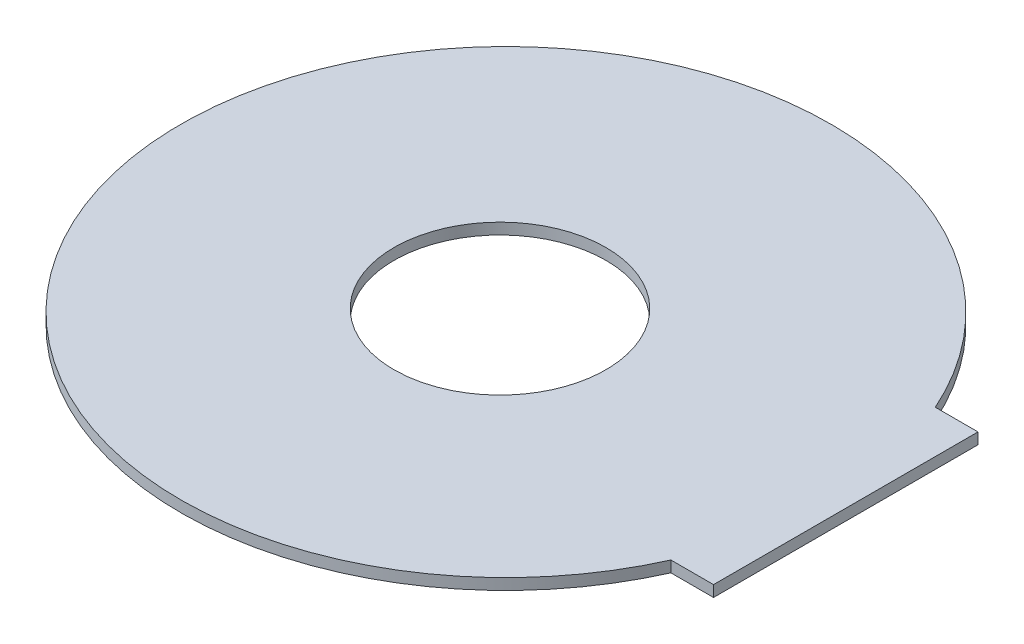
ISO-10303-21;
HEADER;
FILE_DESCRIPTION(('STEP AP214'),'2;1');
FILE_NAME('part.step','',(''),(''),'','','');
FILE_SCHEMA(('AUTOMOTIVE_DESIGN { 1 0 10303 214 1 1 1 1 }'));
ENDSEC;
DATA;
#1=APPLICATION_CONTEXT('core data for automotive mechanical design processes');
#2=APPLICATION_PROTOCOL_DEFINITION('international standard','automotive_design',2000,#1);
#3=PRODUCT_CONTEXT('',#1,'mechanical');
#4=PRODUCT('Part','Part','',(#3));
#5=PRODUCT_RELATED_PRODUCT_CATEGORY('part','',(#4));
#6=PRODUCT_DEFINITION_FORMATION('','',#4);
#7=PRODUCT_DEFINITION_CONTEXT('part definition',#1,'design');
#8=PRODUCT_DEFINITION('design','',#6,#7);
#9=PRODUCT_DEFINITION_SHAPE('','',#8);
#10=(LENGTH_UNIT() NAMED_UNIT(*) SI_UNIT(.MILLI.,.METRE.));
#11=(NAMED_UNIT(*) PLANE_ANGLE_UNIT() SI_UNIT($,.RADIAN.));
#12=(NAMED_UNIT(*) SI_UNIT($,.STERADIAN.) SOLID_ANGLE_UNIT());
#13=UNCERTAINTY_MEASURE_WITH_UNIT(LENGTH_MEASURE(1.E-05),#10,'distance_accuracy_value','');
#14=(GEOMETRIC_REPRESENTATION_CONTEXT(3) GLOBAL_UNCERTAINTY_ASSIGNED_CONTEXT((#13)) GLOBAL_UNIT_ASSIGNED_CONTEXT((#10,
#11,#12)) REPRESENTATION_CONTEXT('',''));
#15=CARTESIAN_POINT('',(0.,0.,0.));
#16=DIRECTION('',(0.,0.,1.));
#17=DIRECTION('',(1.,0.,0.));
#18=AXIS2_PLACEMENT_3D('',#15,#16,#17);
#19=CARTESIAN_POINT('',(116.376935977133,124.639714135106,91.1015697131838));
#20=DIRECTION('',(1.,0.,0.));
#21=DIRECTION('',(0.,0.,-1.));
#22=AXIS2_PLACEMENT_3D('',#19,#20,#21);
#23=PLANE('',#22);
#24=DIRECTION('',(0.,0.,-1.));
#25=VECTOR('',#24,1.);
#26=CARTESIAN_POINT('',(116.376935977133,125.998999999999,91.1015697131838));
#27=LINE('',#26,#25);
#28=CARTESIAN_POINT('',(116.376935977133,125.998999999999,91.1015697131838));
#29=VERTEX_POINT('',#28);
#30=CARTESIAN_POINT('',(116.376935977133,125.999,58.8984302868179));
#31=VERTEX_POINT('',#30);
#32=EDGE_CURVE('E115',#29,#31,#27,.T.);
#33=ORIENTED_EDGE('',*,*,#32,.F.);
#34=DIRECTION('',(0.,1.,0.));
#35=VECTOR('',#34,1.);
#36=CARTESIAN_POINT('',(116.376935977133,124.639714135106,91.1015697131838));
#37=LINE('',#36,#35);
#38=CARTESIAN_POINT('',(116.376935977133,124.639714135106,91.1015697131838));
#39=VERTEX_POINT('',#38);
#40=EDGE_CURVE('E38',#39,#29,#37,.T.);
#41=ORIENTED_EDGE('',*,*,#40,.F.);
#42=DIRECTION('',(0.,0.,-1.));
#43=VECTOR('',#42,1.);
#44=CARTESIAN_POINT('',(116.376935977133,124.639714135106,91.1015697131838));
#45=LINE('',#44,#43);
#46=CARTESIAN_POINT('',(116.376935977133,124.639714135106,58.8984302868179));
#47=VERTEX_POINT('',#46);
#48=EDGE_CURVE('E265',#39,#47,#45,.T.);
#49=ORIENTED_EDGE('',*,*,#48,.T.);
#50=DIRECTION('',(0.,1.,0.));
#51=VECTOR('',#50,1.);
#52=CARTESIAN_POINT('',(116.376935977133,124.639714135106,58.8984302868179));
#53=LINE('',#52,#51);
#54=EDGE_CURVE('E10',#47,#31,#53,.T.);
#55=ORIENTED_EDGE('',*,*,#54,.T.);
#56=EDGE_LOOP('',(#33,#41,#49,#55));
#57=FACE_BOUND('',#56,.T.);
#58=ADVANCED_FACE('F16',(#57),#23,.T.);
#59=CARTESIAN_POINT('',(116.376935977133,124.639714135106,58.8984302868179));
#60=DIRECTION('',(0.,0.,-1.));
#61=DIRECTION('',(0.,1.,0.));
#62=AXIS2_PLACEMENT_3D('',#59,#60,#61);
#63=PLANE('',#62);
#64=DIRECTION('',(-1.,0.,0.));
#65=VECTOR('',#64,1.);
#66=CARTESIAN_POINT('',(116.376935977133,125.999,58.8984302868179));
#67=LINE('',#66,#65);
#68=CARTESIAN_POINT('',(111.187798908326,125.999,58.8984302868179));
#69=VERTEX_POINT('',#68);
#70=EDGE_CURVE('E148',#31,#69,#67,.T.);
#71=ORIENTED_EDGE('',*,*,#70,.F.);
#72=ORIENTED_EDGE('',*,*,#54,.F.);
#73=DIRECTION('',(-1.,0.,0.));
#74=VECTOR('',#73,1.);
#75=CARTESIAN_POINT('',(116.376935977133,124.639714135106,58.8984302868179));
#76=LINE('',#75,#74);
#77=CARTESIAN_POINT('',(111.187798908326,124.639714135106,58.8984302868179));
#78=VERTEX_POINT('',#77);
#79=EDGE_CURVE('E276',#47,#78,#76,.T.);
#80=ORIENTED_EDGE('',*,*,#79,.T.);
#81=DIRECTION('',(0.,1.,0.));
#82=VECTOR('',#81,1.);
#83=CARTESIAN_POINT('',(111.187798908326,124.639714135106,58.8984302868179));
#84=LINE('',#83,#82);
#85=EDGE_CURVE('E29',#78,#69,#84,.T.);
#86=ORIENTED_EDGE('',*,*,#85,.T.);
#87=EDGE_LOOP('',(#71,#72,#80,#86));
#88=FACE_BOUND('',#87,.T.);
#89=ADVANCED_FACE('F138',(#88),#63,.T.);
#90=CARTESIAN_POINT('',(110.457721302983,124.639714135106,60.0000000000007));
#91=DIRECTION('',(-0.833549755446665,0.,-0.552444391042941));
#92=DIRECTION('',(-0.552444391042941,0.,0.833549755446665));
#93=AXIS2_PLACEMENT_3D('',#90,#91,#92);
#94=PLANE('',#93);
#95=DIRECTION('',(-0.552444391042941,0.,0.833549755446665));
#96=VECTOR('',#95,1.);
#97=CARTESIAN_POINT('',(110.457721302983,125.999,60.0000000000007));
#98=LINE('',#97,#96);
#99=CARTESIAN_POINT('',(111.183392037478,125.999,58.9050795463215));
#100=VERTEX_POINT('',#99);
#101=EDGE_CURVE('E149',#69,#100,#98,.T.);
#102=ORIENTED_EDGE('',*,*,#101,.F.);
#103=ORIENTED_EDGE('',*,*,#85,.F.);
#104=DIRECTION('',(-0.552444391042941,0.,0.833549755446665));
#105=VECTOR('',#104,1.);
#106=CARTESIAN_POINT('',(110.457721302983,124.639714135106,60.0000000000007));
#107=LINE('',#106,#105);
#108=CARTESIAN_POINT('',(111.183392037478,124.639714135106,58.9050795463215));
#109=VERTEX_POINT('',#108);
#110=EDGE_CURVE('E97',#78,#109,#107,.T.);
#111=ORIENTED_EDGE('',*,*,#110,.T.);
#112=DIRECTION('',(0.,1.,0.));
#113=VECTOR('',#112,1.);
#114=CARTESIAN_POINT('',(111.183392037478,124.639714135106,58.9050795463215));
#115=LINE('',#114,#113);
#116=EDGE_CURVE('E89',#109,#100,#115,.T.);
#117=ORIENTED_EDGE('',*,*,#116,.T.);
#118=EDGE_LOOP('',(#102,#103,#111,#117));
#119=FACE_BOUND('',#118,.T.);
#120=ADVANCED_FACE('F135',(#119),#94,.T.);
#121=CARTESIAN_POINT('',(75.,124.639714135106,75.0000000000008));
#122=DIRECTION('',(0.,1.,0.));
#123=DIRECTION('',(0.,0.,1.));
#124=AXIS2_PLACEMENT_3D('',#121,#122,#123);
#125=CYLINDRICAL_SURFACE('',#124,39.6015697131829);
#126=CARTESIAN_POINT('',(75.,125.998999999999,75.0000000000008));
#127=DIRECTION('',(0.,1.,0.));
#128=DIRECTION('',(0.913685803354226,0.,-0.406421274970865));
#129=AXIS2_PLACEMENT_3D('',#126,#127,#128);
#130=CIRCLE('',#129,39.6015697131829);
#131=CARTESIAN_POINT('',(111.183392037478,125.999,91.0949204536801));
#132=VERTEX_POINT('',#131);
#133=EDGE_CURVE('E151',#100,#132,#130,.T.);
#134=ORIENTED_EDGE('',*,*,#133,.F.);
#135=ORIENTED_EDGE('',*,*,#116,.F.);
#136=CARTESIAN_POINT('',(75.,124.639714135106,75.0000000000008));
#137=DIRECTION('',(0.,1.,0.));
#138=DIRECTION('',(0.913685803354226,0.,-0.406421274970865));
#139=AXIS2_PLACEMENT_3D('',#136,#137,#138);
#140=CIRCLE('',#139,39.6015697131829);
#141=CARTESIAN_POINT('',(111.183392037478,124.639714135106,91.09492045368));
#142=VERTEX_POINT('',#141);
#143=EDGE_CURVE('E92',#109,#142,#140,.T.);
#144=ORIENTED_EDGE('',*,*,#143,.T.);
#145=DIRECTION('',(0.,1.,0.));
#146=VECTOR('',#145,1.);
#147=CARTESIAN_POINT('',(111.183392037478,124.639714135106,91.09492045368));
#148=LINE('',#147,#146);
#149=EDGE_CURVE('E78',#142,#132,#148,.T.);
#150=ORIENTED_EDGE('',*,*,#149,.T.);
#151=EDGE_LOOP('',(#134,#135,#144,#150));
#152=FACE_BOUND('',#151,.T.);
#153=ADVANCED_FACE('F93',(#152),#125,.T.);
#154=CARTESIAN_POINT('',(111.187798908326,124.639714135106,91.1015697131838));
#155=DIRECTION('',(-0.833549755446666,0.,0.552444391042939));
#156=DIRECTION('',(0.552444391042939,0.,0.833549755446666));
#157=AXIS2_PLACEMENT_3D('',#154,#155,#156);
#158=PLANE('',#157);
#159=DIRECTION('',(0.552444391042939,0.,0.833549755446666));
#160=VECTOR('',#159,1.);
#161=CARTESIAN_POINT('',(111.187798908326,125.998999999999,91.1015697131838));
#162=LINE('',#161,#160);
#163=CARTESIAN_POINT('',(111.187798908326,125.998999999999,91.1015697131838));
#164=VERTEX_POINT('',#163);
#165=EDGE_CURVE('E85',#132,#164,#162,.T.);
#166=ORIENTED_EDGE('',*,*,#165,.F.);
#167=ORIENTED_EDGE('',*,*,#149,.F.);
#168=DIRECTION('',(0.552444391042939,0.,0.833549755446666));
#169=VECTOR('',#168,1.);
#170=CARTESIAN_POINT('',(111.187798908326,124.639714135106,91.1015697131838));
#171=LINE('',#170,#169);
#172=CARTESIAN_POINT('',(111.187798908326,124.639714135106,91.1015697131838));
#173=VERTEX_POINT('',#172);
#174=EDGE_CURVE('E82',#142,#173,#171,.T.);
#175=ORIENTED_EDGE('',*,*,#174,.T.);
#176=DIRECTION('',(0.,1.,0.));
#177=VECTOR('',#176,1.);
#178=CARTESIAN_POINT('',(111.187798908326,124.639714135106,91.1015697131838));
#179=LINE('',#178,#177);
#180=EDGE_CURVE('E60',#173,#164,#179,.T.);
#181=ORIENTED_EDGE('',*,*,#180,.T.);
#182=EDGE_LOOP('',(#166,#167,#175,#181));
#183=FACE_BOUND('',#182,.T.);
#184=ADVANCED_FACE('F80',(#183),#158,.T.);
#185=CARTESIAN_POINT('',(74.2753662639487,124.639714135106,87.8984302868189));
#186=CARTESIAN_POINT('',(73.4311729788096,124.639714135106,87.8984302868189));
#187=CARTESIAN_POINT('',(71.7427864085315,124.639714135106,87.7321387241028));
#188=CARTESIAN_POINT('',(69.3075321766709,124.639714135106,86.9934124291272));
#189=CARTESIAN_POINT('',(67.063189022791,124.639714135106,85.7937860204834));
#190=CARTESIAN_POINT('',(65.096005795653,124.639714135106,84.1793604682974));
#191=CARTESIAN_POINT('',(63.4815802434671,124.639714135106,82.2121772411596));
#192=CARTESIAN_POINT('',(62.2819538348233,124.639714135106,79.9678340872796));
#193=CARTESIAN_POINT('',(61.5432275398477,124.639714135106,77.532579855419));
#194=CARTESIAN_POINT('',(61.2937901957736,124.639714135106,75.0000000000018));
#195=CARTESIAN_POINT('',(61.5432275398477,124.639714135106,72.4674201445847));
#196=CARTESIAN_POINT('',(62.2819538348233,124.639714135106,70.0321659127241));
#197=CARTESIAN_POINT('',(63.4815802434671,124.639714135106,67.7878227588441));
#198=CARTESIAN_POINT('',(65.0960057956531,124.639714135106,65.8206395317062));
#199=CARTESIAN_POINT('',(67.0631890227909,124.639714135106,64.2062139795203));
#200=CARTESIAN_POINT('',(69.3075321766709,124.639714135106,63.0065875708765));
#201=CARTESIAN_POINT('',(71.7427864085315,124.639714135106,62.2678612759008));
#202=CARTESIAN_POINT('',(74.2753662639487,124.639714135106,62.0184239318267));
#203=CARTESIAN_POINT('',(76.8079461193658,124.639714135106,62.2678612759008));
#204=CARTESIAN_POINT('',(79.2432003512264,124.639714135106,63.0065875708765));
#205=CARTESIAN_POINT('',(81.4875435051064,124.639714135106,64.2062139795203));
#206=CARTESIAN_POINT('',(83.4547267322443,124.639714135106,65.8206395317062));
#207=CARTESIAN_POINT('',(85.0691522844302,124.639714135106,67.7878227588441));
#208=CARTESIAN_POINT('',(86.268778693074,124.639714135106,70.0321659127241));
#209=CARTESIAN_POINT('',(87.0075049880497,124.639714135106,72.4674201445847));
#210=CARTESIAN_POINT('',(87.2569423321238,124.639714135106,75.0000000000018));
#211=CARTESIAN_POINT('',(87.0075049880497,124.639714135106,77.532579855419));
#212=CARTESIAN_POINT('',(86.268778693074,124.639714135106,79.9678340872796));
#213=CARTESIAN_POINT('',(85.0691522844302,124.639714135106,82.2121772411596));
#214=CARTESIAN_POINT('',(83.4547267322443,124.639714135106,84.1793604682974));
#215=CARTESIAN_POINT('',(81.4875435051064,124.639714135106,85.7937860204834));
#216=CARTESIAN_POINT('',(79.2432003512264,124.639714135106,86.9934124291271));
#217=CARTESIAN_POINT('',(76.8079461193658,124.639714135106,87.7321387241028));
#218=CARTESIAN_POINT('',(75.1195595490877,124.639714135106,87.8984302868189));
#219=CARTESIAN_POINT('',(74.2753662639487,124.639714135106,87.8984302868189));
#220=B_SPLINE_CURVE_WITH_KNOTS('',3,(#185,#186,#187,#188,#189,#190,#191,#192,#193,#194,#195,
#196,#197,#198,#199,#200,#201,#202,#203,#204,#205,#206,#207,#208,#209,#210,#211,#212,#213,#214,
#215,#216,#217,#218,#219),.UNSPECIFIED.,.T.,.F.,(4,1,1,1,1,1,1,1,1,1,1,1,1,1,1,1,1,1,1,1,1,1,1,
1,1,1,1,1,1,1,1,1,4),(0.,0.0312500000000001,0.0625,0.0937500000000001,0.125,0.15625,0.1875,
0.21875,0.25,0.28125,0.3125,0.34375,0.375,0.40625,0.4375,0.46875,0.5,0.53125,0.5625,0.59375,
0.625,0.65625,0.6875,0.71875,0.75,0.78125,0.8125,0.84375,0.875,0.90625,0.9375,0.96875,1.),.UNSPECIFIED.);
#221=DIRECTION('',(0.,1.,0.));
#222=VECTOR('',#221,1.);
#223=SURFACE_OF_LINEAR_EXTRUSION('',#220,#222);
#224=CARTESIAN_POINT('',(74.2753662639487,124.639714135106,87.8984302868189));
#225=CARTESIAN_POINT('',(73.4311729788096,124.639714135106,87.8984302868189));
#226=CARTESIAN_POINT('',(71.7427864085315,124.639714135106,87.7321387241028));
#227=CARTESIAN_POINT('',(69.3075321766709,124.639714135106,86.9934124291272));
#228=CARTESIAN_POINT('',(67.063189022791,124.639714135106,85.7937860204834));
#229=CARTESIAN_POINT('',(65.096005795653,124.639714135106,84.1793604682974));
#230=CARTESIAN_POINT('',(63.4815802434671,124.639714135106,82.2121772411596));
#231=CARTESIAN_POINT('',(62.2819538348233,124.639714135106,79.9678340872796));
#232=CARTESIAN_POINT('',(61.5432275398477,124.639714135106,77.532579855419));
#233=CARTESIAN_POINT('',(61.2937901957736,124.639714135106,75.0000000000018));
#234=CARTESIAN_POINT('',(61.5432275398477,124.639714135106,72.4674201445847));
#235=CARTESIAN_POINT('',(62.2819538348233,124.639714135106,70.0321659127241));
#236=CARTESIAN_POINT('',(63.4815802434671,124.639714135106,67.7878227588441));
#237=CARTESIAN_POINT('',(65.0960057956531,124.639714135106,65.8206395317062));
#238=CARTESIAN_POINT('',(67.0631890227909,124.639714135106,64.2062139795203));
#239=CARTESIAN_POINT('',(69.3075321766709,124.639714135106,63.0065875708765));
#240=CARTESIAN_POINT('',(71.7427864085315,124.639714135106,62.2678612759008));
#241=CARTESIAN_POINT('',(74.2753662639487,124.639714135106,62.0184239318267));
#242=CARTESIAN_POINT('',(76.8079461193658,124.639714135106,62.2678612759008));
#243=CARTESIAN_POINT('',(79.2432003512264,124.639714135106,63.0065875708765));
#244=CARTESIAN_POINT('',(81.4875435051064,124.639714135106,64.2062139795203));
#245=CARTESIAN_POINT('',(83.4547267322443,124.639714135106,65.8206395317062));
#246=CARTESIAN_POINT('',(85.0691522844302,124.639714135106,67.7878227588441));
#247=CARTESIAN_POINT('',(86.268778693074,124.639714135106,70.0321659127241));
#248=CARTESIAN_POINT('',(87.0075049880497,124.639714135106,72.4674201445847));
#249=CARTESIAN_POINT('',(87.2569423321238,124.639714135106,75.0000000000018));
#250=CARTESIAN_POINT('',(87.0075049880497,124.639714135106,77.532579855419));
#251=CARTESIAN_POINT('',(86.268778693074,124.639714135106,79.9678340872796));
#252=CARTESIAN_POINT('',(85.0691522844302,124.639714135106,82.2121772411596));
#253=CARTESIAN_POINT('',(83.4547267322443,124.639714135106,84.1793604682974));
#254=CARTESIAN_POINT('',(81.4875435051064,124.639714135106,85.7937860204834));
#255=CARTESIAN_POINT('',(79.2432003512264,124.639714135106,86.9934124291271));
#256=CARTESIAN_POINT('',(76.8079461193658,124.639714135106,87.7321387241028));
#257=CARTESIAN_POINT('',(75.1195595490877,124.639714135106,87.8984302868189));
#258=CARTESIAN_POINT('',(74.2753662639487,124.639714135106,87.8984302868189));
#259=B_SPLINE_CURVE_WITH_KNOTS('',3,(#224,#225,#226,#227,#228,#229,#230,#231,#232,#233,#234,
#235,#236,#237,#238,#239,#240,#241,#242,#243,#244,#245,#246,#247,#248,#249,#250,#251,#252,#253,
#254,#255,#256,#257,#258),.UNSPECIFIED.,.T.,.F.,(4,1,1,1,1,1,1,1,1,1,1,1,1,1,1,1,1,1,1,1,1,1,1,
1,1,1,1,1,1,1,1,1,4),(0.,0.0312500000000001,0.0625,0.0937500000000001,0.125,0.15625,0.1875,
0.21875,0.25,0.28125,0.3125,0.34375,0.375,0.40625,0.4375,0.46875,0.5,0.53125,0.5625,0.59375,
0.625,0.65625,0.6875,0.71875,0.75,0.78125,0.8125,0.84375,0.875,0.90625,0.9375,0.96875,1.),.UNSPECIFIED.);
#260=CARTESIAN_POINT('',(74.2753662639487,124.639714135106,87.8984302868189));
#261=VERTEX_POINT('',#260);
#262=EDGE_CURVE('E157',#261,#261,#259,.T.);
#263=ORIENTED_EDGE('',*,*,#262,.T.);
#264=EDGE_LOOP('',(#263));
#265=FACE_BOUND('',#264,.T.);
#266=CARTESIAN_POINT('',(74.2753662639487,125.998999999999,87.8984302868189));
#267=CARTESIAN_POINT('',(74.4864158811465,125.998999999999,87.8984302430427));
#268=CARTESIAN_POINT('',(74.697463962352,125.998999999999,87.8932336134236));
#269=CARTESIAN_POINT('',(75.1190532263872,125.998999999999,87.8724971373808));
#270=CARTESIAN_POINT('',(75.3295944052666,125.998999999999,87.8569572106124));
#271=CARTESIAN_POINT('',(75.749662743733,125.998999999999,87.8155840967069));
#272=CARTESIAN_POINT('',(75.9591899033199,125.998999999999,87.7897509095697));
#273=CARTESIAN_POINT('',(76.3767243702163,125.998999999999,87.7278408867391));
#274=CARTESIAN_POINT('',(76.5847316893191,125.998999999999,87.6917641306181));
#275=CARTESIAN_POINT('',(76.9987186748937,125.998999999999,87.6094170006204));
#276=CARTESIAN_POINT('',(77.2046983413656,125.998999999999,87.5631466267436));
#277=CARTESIAN_POINT('',(77.614141859202,125.998999999999,87.4605604953911));
#278=CARTESIAN_POINT('',(77.8176056910115,125.998999999999,87.4042446598868));
#279=CARTESIAN_POINT('',(78.2215309170167,125.998999999999,87.2817152823195));
#280=CARTESIAN_POINT('',(78.4219923112123,125.998999999999,87.2155017402565));
#281=CARTESIAN_POINT('',(78.8194259570758,125.998999999999,87.0733243592553));
#282=CARTESIAN_POINT('',(79.0163982358346,125.998999999999,86.9973605960596));
#283=CARTESIAN_POINT('',(79.4063654406247,125.998999999999,86.835830890972));
#284=CARTESIAN_POINT('',(79.5993603666559,125.998999999999,86.7502649490802));
#285=CARTESIAN_POINT('',(79.9809229830729,125.998999999999,86.5697715131381));
#286=CARTESIAN_POINT('',(80.1694906390567,125.998999999999,86.4748439463736));
#287=CARTESIAN_POINT('',(80.541750258746,125.998999999999,86.2758670341865));
#288=CARTESIAN_POINT('',(80.7254422224514,125.998999999999,86.171817688764));
#289=CARTESIAN_POINT('',(81.0875018613783,125.998999999999,85.9548367482773));
#290=CARTESIAN_POINT('',(81.2658695779468,125.998999999999,85.8419052222153));
#291=CARTESIAN_POINT('',(81.6168307900186,125.998999999999,85.6074004375708));
#292=CARTESIAN_POINT('',(81.7894242855219,125.998999999999,85.4858271789883));
#293=CARTESIAN_POINT('',(82.1284427607283,125.998999999999,85.2343627000977));
#294=CARTESIAN_POINT('',(82.2948676925046,125.998999999999,85.104471415184));
#295=CARTESIAN_POINT('',(82.6211559781088,125.998999999999,84.8366935394929));
#296=CARTESIAN_POINT('',(82.7810193319365,125.998999999999,84.6988069487155));
#297=CARTESIAN_POINT('',(83.0937912148741,125.998999999999,84.4153609046106));
#298=CARTESIAN_POINT('',(83.2466997979981,125.998999999999,84.269801510893));
#299=CARTESIAN_POINT('',(83.5451677748398,125.998999999999,83.9713335340513));
#300=CARTESIAN_POINT('',(83.6907271685574,125.998999999999,83.8184249509273));
#301=CARTESIAN_POINT('',(83.9741732126623,125.998999999999,83.5056530679897));
#302=CARTESIAN_POINT('',(84.1120598034397,125.998999999999,83.345789714162));
#303=CARTESIAN_POINT('',(84.3798376791309,125.998999999999,83.0195014285578));
#304=CARTESIAN_POINT('',(84.5097289640446,125.998999999999,82.8530764967815));
#305=CARTESIAN_POINT('',(84.7611934429351,125.998999999999,82.5140580215751));
#306=CARTESIAN_POINT('',(84.8827667015176,125.998999999999,82.3414645260717));
#307=CARTESIAN_POINT('',(85.1172714861621,125.998999999999,81.9905033140001));
#308=CARTESIAN_POINT('',(85.2302030122241,125.998999999999,81.8121355974319));
#309=CARTESIAN_POINT('',(85.4471839527108,125.998999999999,81.4500759585041));
#310=CARTESIAN_POINT('',(85.5512332981334,125.998999999999,81.2663839947975));
#311=CARTESIAN_POINT('',(85.7502102103203,125.998999999999,80.8941243751116));
#312=CARTESIAN_POINT('',(85.8451377770846,125.998999999999,80.7055567191324));
#313=CARTESIAN_POINT('',(86.0256312130273,125.998999999999,80.3239941027027));
#314=CARTESIAN_POINT('',(86.11119715492,125.998999999999,80.1309991766543));
#315=CARTESIAN_POINT('',(86.2727268600052,125.998999999999,79.7410319719114));
#316=CARTESIAN_POINT('',(86.3486906231978,125.998999999999,79.5440596932169));
#317=CARTESIAN_POINT('',(86.4908680042077,125.998999999999,79.1466260471775));
#318=CARTESIAN_POINT('',(86.5570815462825,125.998999999999,78.9461646527416));
#319=CARTESIAN_POINT('',(86.6796109238174,125.998999999999,78.5422394273929));
#320=CARTESIAN_POINT('',(86.7359267592774,125.998999999999,78.3387755964801));
#321=CARTESIAN_POINT('',(86.8385128907509,125.998999999999,77.9293320761939));
#322=CARTESIAN_POINT('',(86.8847832647928,125.998999999999,77.7233524063756));
#323=CARTESIAN_POINT('',(86.9671303943393,125.998999999999,77.3093654299435));
#324=CARTESIAN_POINT('',(87.0032071498438,125.998999999999,77.1013581233298));
#325=CARTESIAN_POINT('',(87.0651171743587,125.998999999999,76.6838236223127));
#326=CARTESIAN_POINT('',(87.0909503637968,125.998999999999,76.4742964161156));
#327=CARTESIAN_POINT('',(87.1323234714162,125.998999999999,76.0542282049903));
#328=CARTESIAN_POINT('',(87.1478633895977,125.999,75.8436872000621));
#329=CARTESIAN_POINT('',(87.1685998891002,125.999,75.4220974607854));
#330=CARTESIAN_POINT('',(87.1737965507657,125.999,75.2110487303936));
#331=CARTESIAN_POINT('',(87.1737965507657,125.999,74.7889512696101));
#332=CARTESIAN_POINT('',(87.1685998891002,125.999,74.5779025392183));
#333=CARTESIAN_POINT('',(87.1478633895977,125.999,74.1563127999416));
#334=CARTESIAN_POINT('',(87.1323234714162,125.999,73.9457717950134));
#335=CARTESIAN_POINT('',(87.0909503637968,125.999,73.5257035838881));
#336=CARTESIAN_POINT('',(87.0651171743588,125.999,73.316176377691));
#337=CARTESIAN_POINT('',(87.0032071498438,125.999,72.8986418766739));
#338=CARTESIAN_POINT('',(86.9671303943393,125.999,72.6906345700602));
#339=CARTESIAN_POINT('',(86.8847832647928,125.999,72.2766475936281));
#340=CARTESIAN_POINT('',(86.8385128907509,125.999,72.0706679238098));
#341=CARTESIAN_POINT('',(86.7359267592775,125.999,71.6612244035236));
#342=CARTESIAN_POINT('',(86.6796109238174,125.999,71.4577605726108));
#343=CARTESIAN_POINT('',(86.5570815462825,125.999,71.0538353472621));
#344=CARTESIAN_POINT('',(86.4908680042077,125.999,70.8533739528261));
#345=CARTESIAN_POINT('',(86.3486906231978,125.999,70.4559403067867));
#346=CARTESIAN_POINT('',(86.2727268600052,125.999,70.2589680280923));
#347=CARTESIAN_POINT('',(86.11119715492,125.999,69.8690008233494));
#348=CARTESIAN_POINT('',(86.0256312130273,125.999,69.6760058973009));
#349=CARTESIAN_POINT('',(85.8451377770846,125.999,69.2944432808713));
#350=CARTESIAN_POINT('',(85.7502102103203,125.999,69.1058756248921));
#351=CARTESIAN_POINT('',(85.5512332981334,125.999,68.7336160052062));
#352=CARTESIAN_POINT('',(85.4471839527108,125.999,68.5499240414996));
#353=CARTESIAN_POINT('',(85.2302030122241,125.999,68.1878644025718));
#354=CARTESIAN_POINT('',(85.1172714861621,125.999,68.0094966860036));
#355=CARTESIAN_POINT('',(84.8827667015176,125.999,67.658535473932));
#356=CARTESIAN_POINT('',(84.7611934429351,125.999,67.4859419784286));
#357=CARTESIAN_POINT('',(84.5097289640445,125.999,67.1469235032222));
#358=CARTESIAN_POINT('',(84.3798376791308,125.999,66.9804985714458));
#359=CARTESIAN_POINT('',(84.1120598034397,125.999,66.6542102858418));
#360=CARTESIAN_POINT('',(83.9741732126623,125.999,66.494346932014));
#361=CARTESIAN_POINT('',(83.6907271685574,125.999,66.1815750490764));
#362=CARTESIAN_POINT('',(83.5451677748398,125.999,66.0286664659524));
#363=CARTESIAN_POINT('',(83.2466997979981,125.999,65.7301984891107));
#364=CARTESIAN_POINT('',(83.0937912148741,125.999,65.5846390953931));
#365=CARTESIAN_POINT('',(82.7810193319365,125.999,65.3011930512882));
#366=CARTESIAN_POINT('',(82.6211559781087,125.999,65.1633064605108));
#367=CARTESIAN_POINT('',(82.2948676925046,125.999,64.8955285848196));
#368=CARTESIAN_POINT('',(82.1284427607283,125.999,64.7656372999059));
#369=CARTESIAN_POINT('',(81.7894242855219,125.999,64.5141728210154));
#370=CARTESIAN_POINT('',(81.6168307900185,125.999,64.3925995624329));
#371=CARTESIAN_POINT('',(81.2658695779469,125.999,64.1580947777884));
#372=CARTESIAN_POINT('',(81.0875018613787,125.999,64.0451632517264));
#373=CARTESIAN_POINT('',(80.7254422224509,125.999,63.8281823112397));
#374=CARTESIAN_POINT('',(80.5417502587443,125.999,63.7241329658171));
#375=CARTESIAN_POINT('',(80.1694906390584,125.999,63.5251560536302));
#376=CARTESIAN_POINT('',(79.9809229830792,125.999,63.4302284868659));
#377=CARTESIAN_POINT('',(79.5993603666496,125.999,63.2497350509232));
#378=CARTESIAN_POINT('',(79.4063654406011,125.999,63.1641691090305));
#379=CARTESIAN_POINT('',(79.0163982358582,125.999,63.0026394039453));
#380=CARTESIAN_POINT('',(78.8194259571638,125.999,62.9266756407527));
#381=CARTESIAN_POINT('',(78.4219923111244,125.999,62.7844982597428));
#382=CARTESIAN_POINT('',(78.2215309166885,125.999,62.718284717668));
#383=CARTESIAN_POINT('',(77.8176056913397,125.999,62.5957553401331));
#384=CARTESIAN_POINT('',(77.6141418604269,125.999,62.539439504673));
#385=CARTESIAN_POINT('',(77.2046983401407,125.999,62.4368533731996));
#386=CARTESIAN_POINT('',(76.9987186703224,125.999,62.3905829991577));
#387=CARTESIAN_POINT('',(76.5847316938903,125.999,62.3082358696112));
#388=CARTESIAN_POINT('',(76.3767243872766,125.999,62.2721591141067));
#389=CARTESIAN_POINT('',(75.9591898862595,125.999,62.2102490895918));
#390=CARTESIAN_POINT('',(75.7496626800625,125.999,62.1844159001537));
#391=CARTESIAN_POINT('',(75.3295944689372,125.999,62.1430427925343));
#392=CARTESIAN_POINT('',(75.1190534640089,125.999,62.1275028743528));
#393=CARTESIAN_POINT('',(74.6974637247322,125.999,62.1067663748503));
#394=CARTESIAN_POINT('',(74.4864149943404,125.999,62.1015697131848));
#395=CARTESIAN_POINT('',(74.0643175335569,125.999,62.1015697131848));
#396=CARTESIAN_POINT('',(73.8532688031651,125.999,62.1067663748502));
#397=CARTESIAN_POINT('',(73.4316790638884,125.999,62.1275028743528));
#398=CARTESIAN_POINT('',(73.2211380589602,125.999,62.1430427925343));
#399=CARTESIAN_POINT('',(72.8010698478349,125.999,62.1844159001537));
#400=CARTESIAN_POINT('',(72.5915426416378,125.999,62.2102490895918));
#401=CARTESIAN_POINT('',(72.1740081406207,125.999,62.2721591141067));
#402=CARTESIAN_POINT('',(71.966000834007,125.999,62.3082358696112));
#403=CARTESIAN_POINT('',(71.5520138575749,125.999,62.3905829991577));
#404=CARTESIAN_POINT('',(71.3460341877566,125.999,62.4368533731996));
#405=CARTESIAN_POINT('',(70.9365906674704,125.999,62.539439504673));
#406=CARTESIAN_POINT('',(70.7331268365576,125.999,62.5957553401331));
#407=CARTESIAN_POINT('',(70.3292016112089,125.999,62.718284717668));
#408=CARTESIAN_POINT('',(70.1287402167729,125.999,62.7844982597428));
#409=CARTESIAN_POINT('',(69.7313065707336,125.999,62.9266756407527));
#410=CARTESIAN_POINT('',(69.5343342920391,125.999,63.0026394039452));
#411=CARTESIAN_POINT('',(69.1443670872962,125.999,63.1641691090305));
#412=CARTESIAN_POINT('',(68.9513721612477,125.999,63.2497350509232));
#413=CARTESIAN_POINT('',(68.5698095448181,125.999,63.4302284868659));
#414=CARTESIAN_POINT('',(68.3812418888389,125.999,63.5251560536302));
#415=CARTESIAN_POINT('',(68.008982269153,125.999,63.7241329658171));
#416=CARTESIAN_POINT('',(67.8252903054464,125.999,63.8281823112397));
#417=CARTESIAN_POINT('',(67.4632306665186,125.999,64.0451632517264));
#418=CARTESIAN_POINT('',(67.2848629499504,125.999,64.1580947777884));
#419=CARTESIAN_POINT('',(66.9339017378788,125.999,64.3925995624329));
#420=CARTESIAN_POINT('',(66.7613082423754,125.999,64.5141728210154));
#421=CARTESIAN_POINT('',(66.422289767169,125.999,64.765637299906));
#422=CARTESIAN_POINT('',(66.2558648353927,125.999,64.8955285848197));
#423=CARTESIAN_POINT('',(65.9295765497886,125.999,65.1633064605108));
#424=CARTESIAN_POINT('',(65.7697131959608,125.999,65.3011930512882));
#425=CARTESIAN_POINT('',(65.4569413130232,125.999,65.5846390953931));
#426=CARTESIAN_POINT('',(65.3040327298992,125.999,65.7301984891107));
#427=CARTESIAN_POINT('',(65.0055647530576,125.999,66.0286664659524));
#428=CARTESIAN_POINT('',(64.8600053593399,125.999,66.1815750490764));
#429=CARTESIAN_POINT('',(64.576559315235,125.999,66.494346932014));
#430=CARTESIAN_POINT('',(64.4386727244576,125.999,66.6542102858418));
#431=CARTESIAN_POINT('',(64.1708948487665,125.999,66.9804985714458));
#432=CARTESIAN_POINT('',(64.0410035638528,125.999,67.1469235032222));
#433=CARTESIAN_POINT('',(63.7895390849622,125.999,67.4859419784286));
#434=CARTESIAN_POINT('',(63.6679658263797,125.999,67.658535473932));
#435=CARTESIAN_POINT('',(63.4334610417352,125.999,68.0094966860036));
#436=CARTESIAN_POINT('',(63.3205295156732,125.999,68.1878644025718));
#437=CARTESIAN_POINT('',(63.1035485751865,125.999,68.5499240414996));
#438=CARTESIAN_POINT('',(62.9994992297639,125.999,68.7336160052062));
#439=CARTESIAN_POINT('',(62.800522317577,125.999,69.1058756248921));
#440=CARTESIAN_POINT('',(62.7055947508127,125.999,69.2944432808713));
#441=CARTESIAN_POINT('',(62.5251013148701,125.999,69.6760058973009));
#442=CARTESIAN_POINT('',(62.4395353729773,125.999,69.8690008233494));
#443=CARTESIAN_POINT('',(62.2780056678921,125.999,70.2589680280923));
#444=CARTESIAN_POINT('',(62.2020419046996,125.999,70.4559403067867));
#445=CARTESIAN_POINT('',(62.0598645236896,125.999,70.8533739528261));
#446=CARTESIAN_POINT('',(61.9936509816148,125.999,71.0538353472621));
#447=CARTESIAN_POINT('',(61.8711216040799,125.999,71.4577605726108));
#448=CARTESIAN_POINT('',(61.8148057686199,125.999,71.6612244035236));
#449=CARTESIAN_POINT('',(61.7122196371465,125.999,72.0706679238098));
#450=CARTESIAN_POINT('',(61.6659492631045,125.999,72.2766475936281));
#451=CARTESIAN_POINT('',(61.583602133558,125.999,72.6906345700602));
#452=CARTESIAN_POINT('',(61.5475253780535,125.998999999999,72.8986418766739));
#453=CARTESIAN_POINT('',(61.4856153535386,125.998999999999,73.316176377691));
#454=CARTESIAN_POINT('',(61.4597821641006,125.999,73.525703583888));
#455=CARTESIAN_POINT('',(61.4184090564811,125.999,73.9457717950134));
#456=CARTESIAN_POINT('',(61.4028691382997,125.999,74.1563127999416));
#457=CARTESIAN_POINT('',(61.3821326387971,125.999,74.5779025392183));
#458=CARTESIAN_POINT('',(61.3769359771316,125.999,74.7889512696101));
#459=CARTESIAN_POINT('',(61.3769359771316,125.999,75.2110487303936));
#460=CARTESIAN_POINT('',(61.3821326387971,125.998999999999,75.4220974607854));
#461=CARTESIAN_POINT('',(61.4028691382997,125.998999999999,75.8436872000621));
#462=CARTESIAN_POINT('',(61.4184090564811,125.998999999999,76.0542282049903));
#463=CARTESIAN_POINT('',(61.4597821641006,125.998999999999,76.4742964161156));
#464=CARTESIAN_POINT('',(61.4856153535386,125.998999999999,76.6838236223127));
#465=CARTESIAN_POINT('',(61.5475253780536,125.998999999999,77.1013581233298));
#466=CARTESIAN_POINT('',(61.583602133558,125.998999999999,77.3093654299435));
#467=CARTESIAN_POINT('',(61.6659492631045,125.998999999999,77.7233524063756));
#468=CARTESIAN_POINT('',(61.7122196371465,125.998999999999,77.9293320761939));
#469=CARTESIAN_POINT('',(61.8148057686199,125.998999999999,78.3387755964801));
#470=CARTESIAN_POINT('',(61.8711216040799,125.998999999999,78.5422394273929));
#471=CARTESIAN_POINT('',(61.9936509816148,125.998999999999,78.9461646527417));
#472=CARTESIAN_POINT('',(62.0598645236896,125.998999999999,79.1466260471776));
#473=CARTESIAN_POINT('',(62.2020419046996,125.998999999999,79.5440596932169));
#474=CARTESIAN_POINT('',(62.2780056678921,125.998999999999,79.7410319719114));
#475=CARTESIAN_POINT('',(62.4395353729773,125.998999999999,80.1309991766543));
#476=CARTESIAN_POINT('',(62.5251013148701,125.998999999999,80.3239941027028));
#477=CARTESIAN_POINT('',(62.7055947508127,125.998999999999,80.7055567191324));
#478=CARTESIAN_POINT('',(62.800522317577,125.998999999999,80.8941243751116));
#479=CARTESIAN_POINT('',(62.9994992297639,125.998999999999,81.2663839947975));
#480=CARTESIAN_POINT('',(63.1035485751865,125.998999999999,81.4500759585041));
#481=CARTESIAN_POINT('',(63.3205295156732,125.998999999999,81.8121355974319));
#482=CARTESIAN_POINT('',(63.4334610417352,125.998999999999,81.9905033140001));
#483=CARTESIAN_POINT('',(63.6679658263797,125.998999999999,82.3414645260717));
#484=CARTESIAN_POINT('',(63.7895390849622,125.998999999999,82.5140580215751));
#485=CARTESIAN_POINT('',(64.0410035638528,125.998999999999,82.8530764967815));
#486=CARTESIAN_POINT('',(64.1708948487665,125.998999999999,83.0195014285578));
#487=CARTESIAN_POINT('',(64.4386727244576,125.998999999999,83.3457897141619));
#488=CARTESIAN_POINT('',(64.576559315235,125.998999999999,83.5056530679897));
#489=CARTESIAN_POINT('',(64.8600053593399,125.998999999999,83.8184249509273));
#490=CARTESIAN_POINT('',(65.0055647530576,125.998999999999,83.9713335340513));
#491=CARTESIAN_POINT('',(65.3040327298992,125.998999999999,84.269801510893));
#492=CARTESIAN_POINT('',(65.4569413130232,125.998999999999,84.4153609046106));
#493=CARTESIAN_POINT('',(65.7697131959608,125.998999999999,84.6988069487155));
#494=CARTESIAN_POINT('',(65.9295765497886,125.998999999999,84.8366935394929));
#495=CARTESIAN_POINT('',(66.2558648353927,125.998999999999,85.104471415184));
#496=CARTESIAN_POINT('',(66.422289767169,125.998999999999,85.2343627000977));
#497=CARTESIAN_POINT('',(66.7613082423754,125.998999999999,85.4858271789883));
#498=CARTESIAN_POINT('',(66.9339017378787,125.998999999999,85.6074004375708));
#499=CARTESIAN_POINT('',(67.2848629499505,125.998999999999,85.8419052222153));
#500=CARTESIAN_POINT('',(67.4632306665191,125.998999999999,85.9548367482773));
#501=CARTESIAN_POINT('',(67.8252903054459,125.998999999999,86.171817688764));
#502=CARTESIAN_POINT('',(68.0089822691513,125.998999999999,86.2758670341865));
#503=CARTESIAN_POINT('',(68.3812418888406,125.998999999999,86.4748439463736));
#504=CARTESIAN_POINT('',(68.5698095448245,125.998999999999,86.5697715131381));
#505=CARTESIAN_POINT('',(68.9513721612414,125.998999999999,86.7502649490802));
#506=CARTESIAN_POINT('',(69.1443670872727,125.998999999999,86.835830890972));
#507=CARTESIAN_POINT('',(69.5343342920627,125.998999999999,86.9973605960596));
#508=CARTESIAN_POINT('',(69.7313065708215,125.998999999999,87.0733243592553));
#509=CARTESIAN_POINT('',(70.128740216685,125.998999999999,87.2155017402565));
#510=CARTESIAN_POINT('',(70.3292016108807,125.998999999999,87.2817152823195));
#511=CARTESIAN_POINT('',(70.7331268368858,125.998999999999,87.4042446598868));
#512=CARTESIAN_POINT('',(70.9365906686953,125.998999999999,87.4605604953911));
#513=CARTESIAN_POINT('',(71.3460341865317,125.998999999999,87.5631466267436));
#514=CARTESIAN_POINT('',(71.5520138530036,125.998999999999,87.6094170006204));
#515=CARTESIAN_POINT('',(71.9660008385783,125.998999999999,87.6917641306181));
#516=CARTESIAN_POINT('',(72.174008157681,125.998999999999,87.7278408867391));
#517=CARTESIAN_POINT('',(72.5915426245774,125.998999999999,87.7897509095697));
#518=CARTESIAN_POINT('',(72.8010697841644,125.998999999999,87.8155840967069));
#519=CARTESIAN_POINT('',(73.2211381226307,125.998999999999,87.8569572106124));
#520=CARTESIAN_POINT('',(73.4316793015101,125.998999999999,87.8724971373808));
#521=CARTESIAN_POINT('',(73.8532685655453,125.998999999999,87.8932336134235));
#522=CARTESIAN_POINT('',(74.0643166467508,125.998999999999,87.8984302430426));
#523=CARTESIAN_POINT('',(74.2753662639487,125.998999999999,87.8984302868189));
#524=B_SPLINE_CURVE_WITH_KNOTS('',3,(#266,#267,#268,#269,#270,#271,#272,#273,#274,#275,#276,
#277,#278,#279,#280,#281,#282,#283,#284,#285,#286,#287,#288,#289,#290,#291,#292,#293,#294,#295,
#296,#297,#298,#299,#300,#301,#302,#303,#304,#305,#306,#307,#308,#309,#310,#311,#312,#313,#314,
#315,#316,#317,#318,#319,#320,#321,#322,#323,#324,#325,#326,#327,#328,#329,#330,#331,#332,#333,
#334,#335,#336,#337,#338,#339,#340,#341,#342,#343,#344,#345,#346,#347,#348,#349,#350,#351,#352,
#353,#354,#355,#356,#357,#358,#359,#360,#361,#362,#363,#364,#365,#366,#367,#368,#369,#370,#371,
#372,#373,#374,#375,#376,#377,#378,#379,#380,#381,#382,#383,#384,#385,#386,#387,#388,#389,#390,
#391,#392,#393,#394,#395,#396,#397,#398,#399,#400,#401,#402,#403,#404,#405,#406,#407,#408,#409,
#410,#411,#412,#413,#414,#415,#416,#417,#418,#419,#420,#421,#422,#423,#424,#425,#426,#427,#428,
#429,#430,#431,#432,#433,#434,#435,#436,#437,#438,#439,#440,#441,#442,#443,#444,#445,#446,#447,
#448,#449,#450,#451,#452,#453,#454,#455,#456,#457,#458,#459,#460,#461,#462,#463,#464,#465,#466,
#467,#468,#469,#470,#471,#472,#473,#474,#475,#476,#477,#478,#479,#480,#481,#482,#483,#484,#485,
#486,#487,#488,#489,#490,#491,#492,#493,#494,#495,#496,#497,#498,#499,#500,#501,#502,#503,#504,
#505,#506,#507,#508,#509,#510,#511,#512,#513,#514,#515,#516,#517,#518,#519,#520,#521,#522,#523),
.UNSPECIFIED.,.F.,.F.,(4,2,2,2,2,2,2,2,2,2,2,2,2,2,2,2,2,2,2,2,2,2,2,2,2,2,2,2,2,2,2,2,2,2,2,2,
2,2,2,2,2,2,2,2,2,2,2,2,2,2,2,2,2,2,2,2,2,2,2,2,2,2,2,2,2,2,2,2,2,2,2,2,2,2,2,2,2,2,2,2,2,2,2,2,
2,2,2,2,2,2,2,2,2,2,2,2,2,2,2,2,2,2,2,2,2,2,2,2,2,2,2,2,2,2,2,2,2,2,2,2,2,2,2,2,2,2,2,2,4),(0.,
0.633082878308924,1.26617067433469,1.89925847036047,2.53234134866939,3.1654242269783,
3.79851202300406,4.43159981902983,5.06468269733873,5.69776557564764,6.33085337167341,
6.96394116769916,7.59702404600808,8.230106924317,8.86319472034275,9.49628251636852,
10.1293653946774,10.7624482729863,11.3955360690121,12.0286238650379,12.6617067433468,
13.2947896216557,13.9278774176815,14.5609652137072,15.1940480920162,15.8271309703251,
16.4602187663508,17.0933065623766,17.7263894406855,18.3594723189944,18.9925601150202,
19.6256479110459,20.2587307893549,20.8918136676638,21.5249014636895,22.1579892597153,
22.7910721380242,23.4241550163331,24.0572428123589,24.6903306083847,25.3234134866936,
25.9564963650025,26.5895841610282,27.222671957054,27.8557548353629,28.4888377136718,
29.1219255096976,29.7550133057234,30.3880961840323,31.0211790623412,31.654266858367,
32.2873546543927,32.9204375327016,33.5535204110106,34.1866082070363,34.8196960030621,
35.452778881371,36.0858617596799,36.7189495557057,37.3520373517314,37.9851202300404,
38.6182031083493,39.251290904375,39.8843787004008,40.5174615787097,41.1505444570186,
41.7836322530444,42.4167200490701,43.0498029273791,43.682885805688,44.3159736017138,
44.9490613977395,45.5821442760484,46.2152271543574,46.8483149503831,47.4814027464089,
48.1144856247178,48.7475685030267,49.3806562990525,50.0137440950782,50.6468269733871,
51.2799098516961,51.9129976477218,52.5460854437476,53.1791683220565,53.8122512003654,
54.4453389963912,55.0784267924169,55.7115096707258,56.3445925490348,56.9776803450605,
57.6107681410863,58.2438510193952,58.8769338977041,59.5100216937299,60.1431094897556,
60.7761923680646,61.4092752463735,62.0423630423992,62.675450838425,63.3085337167339,
63.9416165950428,64.5747043910686,65.2077921870944,65.8408750654033,66.4739579437122,
67.1070457397379,67.7401335357637,68.3732164140726,69.0062992923815,69.6393870884073,
70.272474884433,70.9055577627419,71.5386406410509,72.1717284370766,72.8048162331024,
73.4378991114113,74.0709819897202,74.704069785746,75.3371575817717,75.9702404600807,
76.6033233383896,77.2364111344153,77.8694989304411,78.50258180875,79.1356646870589,
79.7687524830847,80.4018402791104,81.0349231574194),.UNSPECIFIED.);
#525=CARTESIAN_POINT('',(74.2753662639487,125.998999999999,87.8984302868189));
#526=VERTEX_POINT('',#525);
#527=EDGE_CURVE('E110',#526,#526,#524,.F.);
#528=ORIENTED_EDGE('',*,*,#527,.F.);
#529=EDGE_LOOP('',(#528));
#530=FACE_BOUND('',#529,.T.);
#531=ADVANCED_FACE('F18',(#265,#530),#223,.T.);
#532=CARTESIAN_POINT('',(111.187798908326,124.639714135106,91.1015697131838));
#533=DIRECTION('',(0.,0.,1.));
#534=DIRECTION('',(0.,-1.,0.));
#535=AXIS2_PLACEMENT_3D('',#532,#533,#534);
#536=PLANE('',#535);
#537=DIRECTION('',(1.,0.,0.));
#538=VECTOR('',#537,1.);
#539=CARTESIAN_POINT('',(111.187798908326,125.998999999999,91.1015697131838));
#540=LINE('',#539,#538);
#541=EDGE_CURVE('E156',#164,#29,#540,.T.);
#542=ORIENTED_EDGE('',*,*,#541,.F.);
#543=ORIENTED_EDGE('',*,*,#180,.F.);
#544=DIRECTION('',(1.,0.,0.));
#545=VECTOR('',#544,1.);
#546=CARTESIAN_POINT('',(111.187798908326,124.639714135106,91.1015697131838));
#547=LINE('',#546,#545);
#548=EDGE_CURVE('E101',#173,#39,#547,.T.);
#549=ORIENTED_EDGE('',*,*,#548,.T.);
#550=ORIENTED_EDGE('',*,*,#40,.T.);
#551=EDGE_LOOP('',(#542,#543,#549,#550));
#552=FACE_BOUND('',#551,.T.);
#553=ADVANCED_FACE('F128',(#552),#536,.T.);
#554=CARTESIAN_POINT('',(110.457721302983,124.639714135106,90.0000000000008));
#555=DIRECTION('',(0.,1.,0.));
#556=DIRECTION('',(-1.,0.,0.));
#557=AXIS2_PLACEMENT_3D('',#554,#555,#556);
#558=PLANE('',#557);
#559=ORIENTED_EDGE('',*,*,#262,.F.);
#560=EDGE_LOOP('',(#559));
#561=FACE_BOUND('',#560,.T.);
#562=ORIENTED_EDGE('',*,*,#48,.F.);
#563=ORIENTED_EDGE('',*,*,#548,.F.);
#564=ORIENTED_EDGE('',*,*,#174,.F.);
#565=ORIENTED_EDGE('',*,*,#143,.F.);
#566=ORIENTED_EDGE('',*,*,#110,.F.);
#567=ORIENTED_EDGE('',*,*,#79,.F.);
#568=EDGE_LOOP('',(#562,#563,#564,#565,#566,#567));
#569=FACE_BOUND('',#568,.T.);
#570=ADVANCED_FACE('F100',(#561,#569),#558,.F.);
#571=CARTESIAN_POINT('',(110.457721302983,125.998999999999,90.0000000000009));
#572=DIRECTION('',(0.,1.,0.));
#573=DIRECTION('',(-1.,0.,0.));
#574=AXIS2_PLACEMENT_3D('',#571,#572,#573);
#575=PLANE('',#574);
#576=ORIENTED_EDGE('',*,*,#527,.T.);
#577=EDGE_LOOP('',(#576));
#578=FACE_BOUND('',#577,.T.);
#579=ORIENTED_EDGE('',*,*,#32,.T.);
#580=ORIENTED_EDGE('',*,*,#70,.T.);
#581=ORIENTED_EDGE('',*,*,#101,.T.);
#582=ORIENTED_EDGE('',*,*,#133,.T.);
#583=ORIENTED_EDGE('',*,*,#165,.T.);
#584=ORIENTED_EDGE('',*,*,#541,.T.);
#585=EDGE_LOOP('',(#579,#580,#581,#582,#583,#584));
#586=FACE_BOUND('',#585,.T.);
#587=ADVANCED_FACE('F117',(#578,#586),#575,.T.);
#588=CLOSED_SHELL('',(#58,#89,#120,#153,#184,#531,#553,#570,#587));
#589=MANIFOLD_SOLID_BREP('B1',#588);
#590=ADVANCED_BREP_SHAPE_REPRESENTATION('',(#18,#589),#14);
#591=SHAPE_DEFINITION_REPRESENTATION(#9,#590);
ENDSEC;
END-ISO-10303-21;
